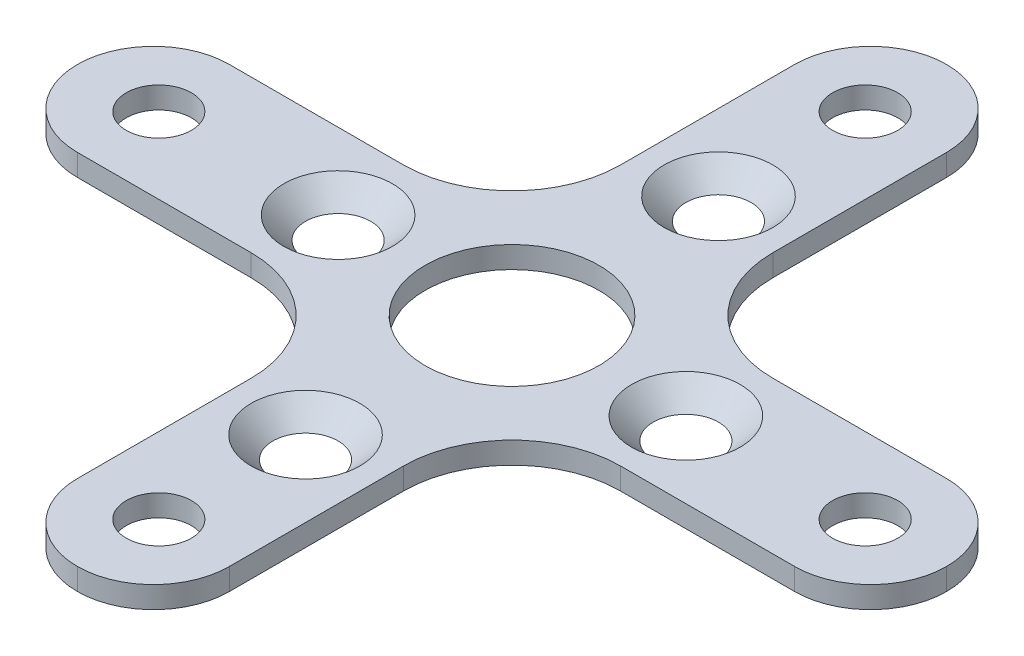
ISO-10303-21;
HEADER;
FILE_DESCRIPTION(('STEP AP214'),'2;1');
FILE_NAME('part.step','',(''),(''),'','','');
FILE_SCHEMA(('AUTOMOTIVE_DESIGN { 1 0 10303 214 1 1 1 1 }'));
ENDSEC;
DATA;
#1=APPLICATION_CONTEXT('core data for automotive mechanical design processes');
#2=APPLICATION_PROTOCOL_DEFINITION('international standard','automotive_design',2000,#1);
#3=PRODUCT_CONTEXT('',#1,'mechanical');
#4=PRODUCT('Part','Part','',(#3));
#5=PRODUCT_RELATED_PRODUCT_CATEGORY('part','',(#4));
#6=PRODUCT_DEFINITION_FORMATION('','',#4);
#7=PRODUCT_DEFINITION_CONTEXT('part definition',#1,'design');
#8=PRODUCT_DEFINITION('design','',#6,#7);
#9=PRODUCT_DEFINITION_SHAPE('','',#8);
#10=(LENGTH_UNIT() NAMED_UNIT(*) SI_UNIT(.MILLI.,.METRE.));
#11=(NAMED_UNIT(*) PLANE_ANGLE_UNIT() SI_UNIT($,.RADIAN.));
#12=(NAMED_UNIT(*) SI_UNIT($,.STERADIAN.) SOLID_ANGLE_UNIT());
#13=UNCERTAINTY_MEASURE_WITH_UNIT(LENGTH_MEASURE(1.E-05),#10,'distance_accuracy_value','');
#14=(GEOMETRIC_REPRESENTATION_CONTEXT(3) GLOBAL_UNCERTAINTY_ASSIGNED_CONTEXT((#13)) GLOBAL_UNIT_ASSIGNED_CONTEXT((#10,
#11,#12)) REPRESENTATION_CONTEXT('',''));
#15=CARTESIAN_POINT('',(0.,0.,0.));
#16=DIRECTION('',(0.,0.,1.));
#17=DIRECTION('',(1.,0.,0.));
#18=AXIS2_PLACEMENT_3D('',#15,#16,#17);
#19=CARTESIAN_POINT('',(0.,1.,3.49999999999999));
#20=DIRECTION('',(0.,0.,-1.));
#21=DIRECTION('',(-1.,0.,0.));
#22=AXIS2_PLACEMENT_3D('',#19,#20,#21);
#23=PLANE('',#22);
#24=DIRECTION('',(1.,0.,0.));
#25=VECTOR('',#24,1.);
#26=CARTESIAN_POINT('',(0.,1.,3.49999999999999));
#27=LINE('',#26,#25);
#28=CARTESIAN_POINT('',(-16.5,1.,3.49999999999999));
#29=VERTEX_POINT('',#28);
#30=CARTESIAN_POINT('',(-8.49999999999999,1.,3.49999999999999));
#31=VERTEX_POINT('',#30);
#32=EDGE_CURVE('E460',#29,#31,#27,.T.);
#33=ORIENTED_EDGE('',*,*,#32,.F.);
#34=DIRECTION('',(0.,-1.,0.));
#35=VECTOR('',#34,1.);
#36=CARTESIAN_POINT('',(-16.5,1.,3.49999999999999));
#37=LINE('',#36,#35);
#38=CARTESIAN_POINT('',(-16.5,0.,3.49999999999999));
#39=VERTEX_POINT('',#38);
#40=EDGE_CURVE('E331',#29,#39,#37,.T.);
#41=ORIENTED_EDGE('',*,*,#40,.T.);
#42=DIRECTION('',(1.,0.,0.));
#43=VECTOR('',#42,1.);
#44=CARTESIAN_POINT('',(0.,0.,3.49999999999999));
#45=LINE('',#44,#43);
#46=CARTESIAN_POINT('',(-8.49999999999999,0.,3.49999999999999));
#47=VERTEX_POINT('',#46);
#48=EDGE_CURVE('E419',#39,#47,#45,.T.);
#49=ORIENTED_EDGE('',*,*,#48,.T.);
#50=DIRECTION('',(0.,-1.,0.));
#51=VECTOR('',#50,1.);
#52=CARTESIAN_POINT('',(-8.49999999999999,1.,3.49999999999999));
#53=LINE('',#52,#51);
#54=EDGE_CURVE('E207',#47,#31,#53,.F.);
#55=ORIENTED_EDGE('',*,*,#54,.T.);
#56=EDGE_LOOP('',(#33,#41,#49,#55));
#57=FACE_BOUND('',#56,.T.);
#58=ADVANCED_FACE('F43',(#57),#23,.F.);
#59=CARTESIAN_POINT('',(-3.5,1.,0.));
#60=DIRECTION('',(1.,0.,0.));
#61=DIRECTION('',(0.,0.,-1.));
#62=AXIS2_PLACEMENT_3D('',#59,#60,#61);
#63=PLANE('',#62);
#64=DIRECTION('',(0.,0.,1.));
#65=VECTOR('',#64,1.);
#66=CARTESIAN_POINT('',(-3.5,0.,0.));
#67=LINE('',#66,#65);
#68=CARTESIAN_POINT('',(-3.5,0.,8.49999999999999));
#69=VERTEX_POINT('',#68);
#70=CARTESIAN_POINT('',(-3.5,0.,16.5));
#71=VERTEX_POINT('',#70);
#72=EDGE_CURVE('E415',#69,#71,#67,.T.);
#73=ORIENTED_EDGE('',*,*,#72,.T.);
#74=DIRECTION('',(0.,-1.,0.));
#75=VECTOR('',#74,1.);
#76=CARTESIAN_POINT('',(-3.5,1.,16.5));
#77=LINE('',#76,#75);
#78=CARTESIAN_POINT('',(-3.5,1.,16.5));
#79=VERTEX_POINT('',#78);
#80=EDGE_CURVE('E338',#71,#79,#77,.F.);
#81=ORIENTED_EDGE('',*,*,#80,.T.);
#82=DIRECTION('',(0.,0.,1.));
#83=VECTOR('',#82,1.);
#84=CARTESIAN_POINT('',(-3.5,1.,0.));
#85=LINE('',#84,#83);
#86=CARTESIAN_POINT('',(-3.5,1.,8.49999999999999));
#87=VERTEX_POINT('',#86);
#88=EDGE_CURVE('E456',#87,#79,#85,.T.);
#89=ORIENTED_EDGE('',*,*,#88,.F.);
#90=DIRECTION('',(0.,-1.,0.));
#91=VECTOR('',#90,1.);
#92=CARTESIAN_POINT('',(-3.5,0.,8.49999999999999));
#93=LINE('',#92,#91);
#94=EDGE_CURVE('E240',#87,#69,#93,.T.);
#95=ORIENTED_EDGE('',*,*,#94,.T.);
#96=EDGE_LOOP('',(#73,#81,#89,#95));
#97=FACE_BOUND('',#96,.T.);
#98=ADVANCED_FACE('F512',(#97),#63,.F.);
#99=CARTESIAN_POINT('',(3.5,1.,0.));
#100=DIRECTION('',(1.,0.,0.));
#101=DIRECTION('',(0.,0.,-1.));
#102=AXIS2_PLACEMENT_3D('',#99,#100,#101);
#103=PLANE('',#102);
#104=DIRECTION('',(0.,0.,1.));
#105=VECTOR('',#104,1.);
#106=CARTESIAN_POINT('',(3.5,1.,0.));
#107=LINE('',#106,#105);
#108=CARTESIAN_POINT('',(3.5,1.,8.49999999999999));
#109=VERTEX_POINT('',#108);
#110=CARTESIAN_POINT('',(3.5,1.,16.5));
#111=VERTEX_POINT('',#110);
#112=EDGE_CURVE('E452',#109,#111,#107,.T.);
#113=ORIENTED_EDGE('',*,*,#112,.T.);
#114=DIRECTION('',(0.,-1.,0.));
#115=VECTOR('',#114,1.);
#116=CARTESIAN_POINT('',(3.5,0.,16.5));
#117=LINE('',#116,#115);
#118=CARTESIAN_POINT('',(3.5,0.,16.5));
#119=VERTEX_POINT('',#118);
#120=EDGE_CURVE('E334',#111,#119,#117,.T.);
#121=ORIENTED_EDGE('',*,*,#120,.T.);
#122=DIRECTION('',(0.,0.,1.));
#123=VECTOR('',#122,1.);
#124=CARTESIAN_POINT('',(3.5,0.,0.));
#125=LINE('',#124,#123);
#126=CARTESIAN_POINT('',(3.5,0.,8.49999999999999));
#127=VERTEX_POINT('',#126);
#128=EDGE_CURVE('E411',#127,#119,#125,.T.);
#129=ORIENTED_EDGE('',*,*,#128,.F.);
#130=DIRECTION('',(0.,-1.,0.));
#131=VECTOR('',#130,1.);
#132=CARTESIAN_POINT('',(3.5,1.,8.49999999999999));
#133=LINE('',#132,#131);
#134=EDGE_CURVE('E237',#127,#109,#133,.F.);
#135=ORIENTED_EDGE('',*,*,#134,.T.);
#136=EDGE_LOOP('',(#113,#121,#129,#135));
#137=FACE_BOUND('',#136,.T.);
#138=ADVANCED_FACE('F518',(#137),#103,.T.);
#139=CARTESIAN_POINT('',(0.,1.,3.49999999999999));
#140=DIRECTION('',(0.,0.,-1.));
#141=DIRECTION('',(-1.,0.,0.));
#142=AXIS2_PLACEMENT_3D('',#139,#140,#141);
#143=PLANE('',#142);
#144=DIRECTION('',(1.,0.,0.));
#145=VECTOR('',#144,1.);
#146=CARTESIAN_POINT('',(0.,0.,3.49999999999999));
#147=LINE('',#146,#145);
#148=CARTESIAN_POINT('',(8.5,0.,3.49999999999999));
#149=VERTEX_POINT('',#148);
#150=CARTESIAN_POINT('',(16.5,0.,3.49999999999999));
#151=VERTEX_POINT('',#150);
#152=EDGE_CURVE('E407',#149,#151,#147,.T.);
#153=ORIENTED_EDGE('',*,*,#152,.T.);
#154=DIRECTION('',(0.,-1.,0.));
#155=VECTOR('',#154,1.);
#156=CARTESIAN_POINT('',(16.5,1.,3.49999999999999));
#157=LINE('',#156,#155);
#158=CARTESIAN_POINT('',(16.5,1.,3.49999999999999));
#159=VERTEX_POINT('',#158);
#160=EDGE_CURVE('E292',#151,#159,#157,.F.);
#161=ORIENTED_EDGE('',*,*,#160,.T.);
#162=DIRECTION('',(1.,0.,0.));
#163=VECTOR('',#162,1.);
#164=CARTESIAN_POINT('',(0.,1.,3.49999999999999));
#165=LINE('',#164,#163);
#166=CARTESIAN_POINT('',(8.5,1.,3.49999999999999));
#167=VERTEX_POINT('',#166);
#168=EDGE_CURVE('E448',#167,#159,#165,.T.);
#169=ORIENTED_EDGE('',*,*,#168,.F.);
#170=DIRECTION('',(0.,-1.,0.));
#171=VECTOR('',#170,1.);
#172=CARTESIAN_POINT('',(8.5,1.,3.49999999999999));
#173=LINE('',#172,#171);
#174=EDGE_CURVE('E233',#167,#149,#173,.T.);
#175=ORIENTED_EDGE('',*,*,#174,.T.);
#176=EDGE_LOOP('',(#153,#161,#169,#175));
#177=FACE_BOUND('',#176,.T.);
#178=ADVANCED_FACE('F625',(#177),#143,.F.);
#179=CARTESIAN_POINT('',(0.,1.,-3.50000000000001));
#180=DIRECTION('',(0.,0.,-1.));
#181=DIRECTION('',(-1.,0.,0.));
#182=AXIS2_PLACEMENT_3D('',#179,#180,#181);
#183=PLANE('',#182);
#184=DIRECTION('',(1.,0.,0.));
#185=VECTOR('',#184,1.);
#186=CARTESIAN_POINT('',(0.,1.,-3.50000000000001));
#187=LINE('',#186,#185);
#188=CARTESIAN_POINT('',(8.5,1.,-3.50000000000001));
#189=VERTEX_POINT('',#188);
#190=CARTESIAN_POINT('',(16.5,1.,-3.50000000000001));
#191=VERTEX_POINT('',#190);
#192=EDGE_CURVE('E444',#189,#191,#187,.T.);
#193=ORIENTED_EDGE('',*,*,#192,.T.);
#194=DIRECTION('',(0.,-1.,0.));
#195=VECTOR('',#194,1.);
#196=CARTESIAN_POINT('',(16.5,1.,-3.50000000000001));
#197=LINE('',#196,#195);
#198=CARTESIAN_POINT('',(16.5,0.,-3.50000000000001));
#199=VERTEX_POINT('',#198);
#200=EDGE_CURVE('E318',#191,#199,#197,.T.);
#201=ORIENTED_EDGE('',*,*,#200,.T.);
#202=DIRECTION('',(1.,0.,0.));
#203=VECTOR('',#202,1.);
#204=CARTESIAN_POINT('',(0.,0.,-3.50000000000001));
#205=LINE('',#204,#203);
#206=CARTESIAN_POINT('',(8.5,0.,-3.50000000000001));
#207=VERTEX_POINT('',#206);
#208=EDGE_CURVE('E403',#207,#199,#205,.T.);
#209=ORIENTED_EDGE('',*,*,#208,.F.);
#210=DIRECTION('',(0.,-1.,0.));
#211=VECTOR('',#210,1.);
#212=CARTESIAN_POINT('',(8.5,1.,-3.50000000000001));
#213=LINE('',#212,#211);
#214=EDGE_CURVE('E230',#207,#189,#213,.F.);
#215=ORIENTED_EDGE('',*,*,#214,.T.);
#216=EDGE_LOOP('',(#193,#201,#209,#215));
#217=FACE_BOUND('',#216,.T.);
#218=ADVANCED_FACE('F621',(#217),#183,.T.);
#219=CARTESIAN_POINT('',(3.5,1.,0.));
#220=DIRECTION('',(1.,0.,0.));
#221=DIRECTION('',(0.,0.,-1.));
#222=AXIS2_PLACEMENT_3D('',#219,#220,#221);
#223=PLANE('',#222);
#224=DIRECTION('',(0.,0.,1.));
#225=VECTOR('',#224,1.);
#226=CARTESIAN_POINT('',(3.5,0.,0.));
#227=LINE('',#226,#225);
#228=CARTESIAN_POINT('',(3.5,0.,-16.5));
#229=VERTEX_POINT('',#228);
#230=CARTESIAN_POINT('',(3.5,0.,-8.50000000000001));
#231=VERTEX_POINT('',#230);
#232=EDGE_CURVE('E400',#229,#231,#227,.T.);
#233=ORIENTED_EDGE('',*,*,#232,.F.);
#234=DIRECTION('',(0.,-1.,0.));
#235=VECTOR('',#234,1.);
#236=CARTESIAN_POINT('',(3.5,1.,-16.5));
#237=LINE('',#236,#235);
#238=CARTESIAN_POINT('',(3.5,1.,-16.5));
#239=VERTEX_POINT('',#238);
#240=EDGE_CURVE('E321',#229,#239,#237,.F.);
#241=ORIENTED_EDGE('',*,*,#240,.T.);
#242=DIRECTION('',(0.,0.,1.));
#243=VECTOR('',#242,1.);
#244=CARTESIAN_POINT('',(3.5,1.,0.));
#245=LINE('',#244,#243);
#246=CARTESIAN_POINT('',(3.5,1.,-8.50000000000001));
#247=VERTEX_POINT('',#246);
#248=EDGE_CURVE('E441',#239,#247,#245,.T.);
#249=ORIENTED_EDGE('',*,*,#248,.T.);
#250=DIRECTION('',(0.,-1.,0.));
#251=VECTOR('',#250,1.);
#252=CARTESIAN_POINT('',(3.5,0.,-8.50000000000001));
#253=LINE('',#252,#251);
#254=EDGE_CURVE('E218',#247,#231,#253,.T.);
#255=ORIENTED_EDGE('',*,*,#254,.T.);
#256=EDGE_LOOP('',(#233,#241,#249,#255));
#257=FACE_BOUND('',#256,.T.);
#258=ADVANCED_FACE('F615',(#257),#223,.T.);
#259=CARTESIAN_POINT('',(-3.5,1.,0.));
#260=DIRECTION('',(1.,0.,0.));
#261=DIRECTION('',(0.,0.,-1.));
#262=AXIS2_PLACEMENT_3D('',#259,#260,#261);
#263=PLANE('',#262);
#264=DIRECTION('',(0.,0.,1.));
#265=VECTOR('',#264,1.);
#266=CARTESIAN_POINT('',(-3.5,1.,0.));
#267=LINE('',#266,#265);
#268=CARTESIAN_POINT('',(-3.5,1.,-16.5));
#269=VERTEX_POINT('',#268);
#270=CARTESIAN_POINT('',(-3.5,1.,-8.50000000000001));
#271=VERTEX_POINT('',#270);
#272=EDGE_CURVE('E438',#269,#271,#267,.T.);
#273=ORIENTED_EDGE('',*,*,#272,.F.);
#274=DIRECTION('',(0.,-1.,0.));
#275=VECTOR('',#274,1.);
#276=CARTESIAN_POINT('',(-3.5,0.,-16.5));
#277=LINE('',#276,#275);
#278=CARTESIAN_POINT('',(-3.5,0.,-16.5));
#279=VERTEX_POINT('',#278);
#280=EDGE_CURVE('E325',#269,#279,#277,.T.);
#281=ORIENTED_EDGE('',*,*,#280,.T.);
#282=DIRECTION('',(0.,0.,1.));
#283=VECTOR('',#282,1.);
#284=CARTESIAN_POINT('',(-3.5,0.,0.));
#285=LINE('',#284,#283);
#286=CARTESIAN_POINT('',(-3.5,0.,-8.50000000000001));
#287=VERTEX_POINT('',#286);
#288=EDGE_CURVE('E196',#279,#287,#285,.T.);
#289=ORIENTED_EDGE('',*,*,#288,.T.);
#290=DIRECTION('',(0.,-1.,0.));
#291=VECTOR('',#290,1.);
#292=CARTESIAN_POINT('',(-3.5,1.,-8.50000000000001));
#293=LINE('',#292,#291);
#294=EDGE_CURVE('E204',#287,#271,#293,.F.);
#295=ORIENTED_EDGE('',*,*,#294,.T.);
#296=EDGE_LOOP('',(#273,#281,#289,#295));
#297=FACE_BOUND('',#296,.T.);
#298=ADVANCED_FACE('F607',(#297),#263,.F.);
#299=CARTESIAN_POINT('',(0.,1.,-16.25));
#300=DIRECTION('',(0.,-1.,0.));
#301=DIRECTION('',(0.,0.,-1.));
#302=AXIS2_PLACEMENT_3D('',#299,#300,#301);
#303=CYLINDRICAL_SURFACE('',#302,1.5);
#304=CARTESIAN_POINT('',(0.,1.,-16.25));
#305=DIRECTION('',(0.,1.,0.));
#306=DIRECTION('',(0.,0.,1.));
#307=AXIS2_PLACEMENT_3D('',#304,#305,#306);
#308=CIRCLE('',#307,1.5);
#309=CARTESIAN_POINT('',(0.,1.,-14.75));
#310=VERTEX_POINT('',#309);
#311=EDGE_CURVE('E221',#310,#310,#308,.T.);
#312=ORIENTED_EDGE('',*,*,#311,.T.);
#313=EDGE_LOOP('',(#312));
#314=FACE_BOUND('',#313,.T.);
#315=CARTESIAN_POINT('',(0.,0.,-16.25));
#316=DIRECTION('',(0.,1.,0.));
#317=DIRECTION('',(0.,0.,1.));
#318=AXIS2_PLACEMENT_3D('',#315,#316,#317);
#319=CIRCLE('',#318,1.5);
#320=CARTESIAN_POINT('',(0.,0.,-14.75));
#321=VERTEX_POINT('',#320);
#322=EDGE_CURVE('E383',#321,#321,#319,.T.);
#323=ORIENTED_EDGE('',*,*,#322,.F.);
#324=EDGE_LOOP('',(#323));
#325=FACE_BOUND('',#324,.T.);
#326=ADVANCED_FACE('F605',(#314,#325),#303,.F.);
#327=CARTESIAN_POINT('',(0.,1.,-3.50000000000001));
#328=DIRECTION('',(0.,0.,-1.));
#329=DIRECTION('',(-1.,0.,0.));
#330=AXIS2_PLACEMENT_3D('',#327,#328,#329);
#331=PLANE('',#330);
#332=DIRECTION('',(1.,0.,0.));
#333=VECTOR('',#332,1.);
#334=CARTESIAN_POINT('',(0.,0.,-3.50000000000001));
#335=LINE('',#334,#333);
#336=CARTESIAN_POINT('',(-16.5,0.,-3.50000000000001));
#337=VERTEX_POINT('',#336);
#338=CARTESIAN_POINT('',(-8.5,0.,-3.50000000000001));
#339=VERTEX_POINT('',#338);
#340=EDGE_CURVE('E183',#337,#339,#335,.T.);
#341=ORIENTED_EDGE('',*,*,#340,.F.);
#342=DIRECTION('',(0.,-1.,0.));
#343=VECTOR('',#342,1.);
#344=CARTESIAN_POINT('',(-16.5,1.,-3.50000000000001));
#345=LINE('',#344,#343);
#346=CARTESIAN_POINT('',(-16.5,1.,-3.50000000000001));
#347=VERTEX_POINT('',#346);
#348=EDGE_CURVE('E328',#337,#347,#345,.F.);
#349=ORIENTED_EDGE('',*,*,#348,.T.);
#350=DIRECTION('',(1.,0.,0.));
#351=VECTOR('',#350,1.);
#352=CARTESIAN_POINT('',(0.,1.,-3.50000000000001));
#353=LINE('',#352,#351);
#354=CARTESIAN_POINT('',(-8.5,1.,-3.50000000000001));
#355=VERTEX_POINT('',#354);
#356=EDGE_CURVE('E211',#347,#355,#353,.T.);
#357=ORIENTED_EDGE('',*,*,#356,.T.);
#358=DIRECTION('',(0.,-1.,0.));
#359=VECTOR('',#358,1.);
#360=CARTESIAN_POINT('',(-8.5,1.,-3.50000000000001));
#361=LINE('',#360,#359);
#362=EDGE_CURVE('E202',#355,#339,#361,.T.);
#363=ORIENTED_EDGE('',*,*,#362,.T.);
#364=EDGE_LOOP('',(#341,#349,#357,#363));
#365=FACE_BOUND('',#364,.T.);
#366=ADVANCED_FACE('F209',(#365),#331,.T.);
#367=CARTESIAN_POINT('',(0.,1.,16.25));
#368=DIRECTION('',(0.,-1.,0.));
#369=DIRECTION('',(0.,0.,-1.));
#370=AXIS2_PLACEMENT_3D('',#367,#368,#369);
#371=CYLINDRICAL_SURFACE('',#370,1.5);
#372=CARTESIAN_POINT('',(0.,1.,16.25));
#373=DIRECTION('',(0.,1.,0.));
#374=DIRECTION('',(0.,0.,1.));
#375=AXIS2_PLACEMENT_3D('',#372,#373,#374);
#376=CIRCLE('',#375,1.5);
#377=CARTESIAN_POINT('',(0.,1.,17.75));
#378=VERTEX_POINT('',#377);
#379=EDGE_CURVE('E463',#378,#378,#376,.T.);
#380=ORIENTED_EDGE('',*,*,#379,.T.);
#381=EDGE_LOOP('',(#380));
#382=FACE_BOUND('',#381,.T.);
#383=CARTESIAN_POINT('',(0.,0.,16.25));
#384=DIRECTION('',(0.,1.,0.));
#385=DIRECTION('',(0.,0.,1.));
#386=AXIS2_PLACEMENT_3D('',#383,#384,#385);
#387=CIRCLE('',#386,1.5);
#388=CARTESIAN_POINT('',(0.,0.,17.75));
#389=VERTEX_POINT('',#388);
#390=EDGE_CURVE('E422',#389,#389,#387,.T.);
#391=ORIENTED_EDGE('',*,*,#390,.F.);
#392=EDGE_LOOP('',(#391));
#393=FACE_BOUND('',#392,.T.);
#394=ADVANCED_FACE('F524',(#382,#393),#371,.F.);
#395=CARTESIAN_POINT('',(-16.25,1.,0.));
#396=DIRECTION('',(0.,-1.,0.));
#397=DIRECTION('',(0.,0.,-1.));
#398=AXIS2_PLACEMENT_3D('',#395,#396,#397);
#399=CYLINDRICAL_SURFACE('',#398,1.5);
#400=CARTESIAN_POINT('',(-16.25,1.,0.));
#401=DIRECTION('',(0.,1.,0.));
#402=DIRECTION('',(0.,0.,1.));
#403=AXIS2_PLACEMENT_3D('',#400,#401,#402);
#404=CIRCLE('',#403,1.5);
#405=CARTESIAN_POINT('',(-16.25,1.,1.49999999999999));
#406=VERTEX_POINT('',#405);
#407=EDGE_CURVE('E387',#406,#406,#404,.T.);
#408=ORIENTED_EDGE('',*,*,#407,.T.);
#409=EDGE_LOOP('',(#408));
#410=FACE_BOUND('',#409,.T.);
#411=CARTESIAN_POINT('',(-16.25,0.,0.));
#412=DIRECTION('',(0.,1.,0.));
#413=DIRECTION('',(0.,0.,1.));
#414=AXIS2_PLACEMENT_3D('',#411,#412,#413);
#415=CIRCLE('',#414,1.5);
#416=CARTESIAN_POINT('',(-16.25,0.,1.49999999999999));
#417=VERTEX_POINT('',#416);
#418=EDGE_CURVE('E346',#417,#417,#415,.T.);
#419=ORIENTED_EDGE('',*,*,#418,.F.);
#420=EDGE_LOOP('',(#419));
#421=FACE_BOUND('',#420,.T.);
#422=ADVANCED_FACE('F497',(#410,#421),#399,.F.);
#423=CARTESIAN_POINT('',(16.25,1.,0.));
#424=DIRECTION('',(0.,-1.,0.));
#425=DIRECTION('',(0.,0.,-1.));
#426=AXIS2_PLACEMENT_3D('',#423,#424,#425);
#427=CYLINDRICAL_SURFACE('',#426,1.5);
#428=CARTESIAN_POINT('',(16.25,1.,0.));
#429=DIRECTION('',(0.,1.,0.));
#430=DIRECTION('',(0.,0.,1.));
#431=AXIS2_PLACEMENT_3D('',#428,#429,#430);
#432=CIRCLE('',#431,1.5);
#433=CARTESIAN_POINT('',(16.25,1.,1.49999999999999));
#434=VERTEX_POINT('',#433);
#435=EDGE_CURVE('E214',#434,#434,#432,.T.);
#436=ORIENTED_EDGE('',*,*,#435,.T.);
#437=EDGE_LOOP('',(#436));
#438=FACE_BOUND('',#437,.T.);
#439=CARTESIAN_POINT('',(16.25,0.,0.));
#440=DIRECTION('',(0.,1.,0.));
#441=DIRECTION('',(0.,0.,1.));
#442=AXIS2_PLACEMENT_3D('',#439,#440,#441);
#443=CIRCLE('',#442,1.5);
#444=CARTESIAN_POINT('',(16.25,0.,1.49999999999999));
#445=VERTEX_POINT('',#444);
#446=EDGE_CURVE('E224',#445,#445,#443,.T.);
#447=ORIENTED_EDGE('',*,*,#446,.F.);
#448=EDGE_LOOP('',(#447));
#449=FACE_BOUND('',#448,.T.);
#450=ADVANCED_FACE('F483',(#438,#449),#427,.F.);
#451=CARTESIAN_POINT('',(0.,1.,0.));
#452=DIRECTION('',(0.,1.,0.));
#453=DIRECTION('',(0.,0.,1.));
#454=AXIS2_PLACEMENT_3D('',#451,#452,#453);
#455=PLANE('',#454);
#456=CARTESIAN_POINT('',(0.,1.,-9.5));
#457=DIRECTION('',(0.,1.,0.));
#458=DIRECTION('',(0.,0.,1.));
#459=AXIS2_PLACEMENT_3D('',#456,#457,#458);
#460=CIRCLE('',#459,2.5);
#461=CARTESIAN_POINT('',(0.,1.,-7.));
#462=VERTEX_POINT('',#461);
#463=EDGE_CURVE('E11',#462,#462,#460,.F.);
#464=ORIENTED_EDGE('',*,*,#463,.T.);
#465=EDGE_LOOP('',(#464));
#466=FACE_BOUND('',#465,.T.);
#467=CARTESIAN_POINT('',(8.,1.,0.));
#468=DIRECTION('',(0.,1.,0.));
#469=DIRECTION('',(0.,0.,1.));
#470=AXIS2_PLACEMENT_3D('',#467,#468,#469);
#471=CIRCLE('',#470,2.50000000000002);
#472=CARTESIAN_POINT('',(8.,1.,2.50000000000001));
#473=VERTEX_POINT('',#472);
#474=EDGE_CURVE('E53',#473,#473,#471,.F.);
#475=ORIENTED_EDGE('',*,*,#474,.T.);
#476=EDGE_LOOP('',(#475));
#477=FACE_BOUND('',#476,.T.);
#478=CARTESIAN_POINT('',(-8.,1.,0.));
#479=DIRECTION('',(0.,1.,0.));
#480=DIRECTION('',(0.,0.,1.));
#481=AXIS2_PLACEMENT_3D('',#478,#479,#480);
#482=CIRCLE('',#481,2.50000000000002);
#483=CARTESIAN_POINT('',(-8.,1.,2.50000000000001));
#484=VERTEX_POINT('',#483);
#485=EDGE_CURVE('E362',#484,#484,#482,.F.);
#486=ORIENTED_EDGE('',*,*,#485,.T.);
#487=EDGE_LOOP('',(#486));
#488=FACE_BOUND('',#487,.T.);
#489=CARTESIAN_POINT('',(0.,1.,9.5));
#490=DIRECTION('',(0.,1.,0.));
#491=DIRECTION('',(0.,0.,1.));
#492=AXIS2_PLACEMENT_3D('',#489,#490,#491);
#493=CIRCLE('',#492,2.50000000000002);
#494=CARTESIAN_POINT('',(0.,1.,12.));
#495=VERTEX_POINT('',#494);
#496=EDGE_CURVE('E341',#495,#495,#493,.F.);
#497=ORIENTED_EDGE('',*,*,#496,.T.);
#498=EDGE_LOOP('',(#497));
#499=FACE_BOUND('',#498,.T.);
#500=CARTESIAN_POINT('',(0.,1.,0.));
#501=DIRECTION('',(0.,1.,0.));
#502=DIRECTION('',(0.,0.,1.));
#503=AXIS2_PLACEMENT_3D('',#500,#501,#502);
#504=CIRCLE('',#503,4.);
#505=CARTESIAN_POINT('',(0.,1.,4.));
#506=VERTEX_POINT('',#505);
#507=EDGE_CURVE('E473',#506,#506,#504,.T.);
#508=ORIENTED_EDGE('',*,*,#507,.F.);
#509=EDGE_LOOP('',(#508));
#510=FACE_BOUND('',#509,.T.);
#511=ORIENTED_EDGE('',*,*,#407,.F.);
#512=EDGE_LOOP('',(#511));
#513=FACE_BOUND('',#512,.T.);
#514=ORIENTED_EDGE('',*,*,#379,.F.);
#515=EDGE_LOOP('',(#514));
#516=FACE_BOUND('',#515,.T.);
#517=ORIENTED_EDGE('',*,*,#168,.T.);
#518=CARTESIAN_POINT('',(16.5,1.,0.));
#519=DIRECTION('',(0.,1.,0.));
#520=DIRECTION('',(0.,0.,1.));
#521=AXIS2_PLACEMENT_3D('',#518,#519,#520);
#522=CIRCLE('',#521,3.5);
#523=CARTESIAN_POINT('',(20.,1.,0.));
#524=VERTEX_POINT('',#523);
#525=EDGE_CURVE('E315',#159,#524,#522,.T.);
#526=ORIENTED_EDGE('',*,*,#525,.T.);
#527=CARTESIAN_POINT('',(16.5,1.,0.));
#528=DIRECTION('',(0.,1.,0.));
#529=DIRECTION('',(0.,0.,1.));
#530=AXIS2_PLACEMENT_3D('',#527,#528,#529);
#531=CIRCLE('',#530,3.5);
#532=EDGE_CURVE('E312',#524,#191,#531,.T.);
#533=ORIENTED_EDGE('',*,*,#532,.T.);
#534=ORIENTED_EDGE('',*,*,#192,.F.);
#535=CARTESIAN_POINT('',(8.5,1.,-8.50000000000001));
#536=DIRECTION('',(0.,1.,0.));
#537=DIRECTION('',(0.,0.,1.));
#538=AXIS2_PLACEMENT_3D('',#535,#536,#537);
#539=CIRCLE('',#538,5.);
#540=EDGE_CURVE('E252',#189,#247,#539,.F.);
#541=ORIENTED_EDGE('',*,*,#540,.T.);
#542=ORIENTED_EDGE('',*,*,#248,.F.);
#543=CARTESIAN_POINT('',(0.,1.,-16.5));
#544=DIRECTION('',(0.,1.,0.));
#545=DIRECTION('',(0.,0.,1.));
#546=AXIS2_PLACEMENT_3D('',#543,#544,#545);
#547=CIRCLE('',#546,3.5);
#548=CARTESIAN_POINT('',(0.,1.,-20.));
#549=VERTEX_POINT('',#548);
#550=EDGE_CURVE('E309',#239,#549,#547,.T.);
#551=ORIENTED_EDGE('',*,*,#550,.T.);
#552=CARTESIAN_POINT('',(0.,1.,-16.5));
#553=DIRECTION('',(0.,1.,0.));
#554=DIRECTION('',(0.,0.,1.));
#555=AXIS2_PLACEMENT_3D('',#552,#553,#554);
#556=CIRCLE('',#555,3.5);
#557=EDGE_CURVE('E68',#549,#269,#556,.T.);
#558=ORIENTED_EDGE('',*,*,#557,.T.);
#559=ORIENTED_EDGE('',*,*,#272,.T.);
#560=CARTESIAN_POINT('',(-8.5,1.,-8.50000000000001));
#561=DIRECTION('',(0.,1.,0.));
#562=DIRECTION('',(0.,0.,1.));
#563=AXIS2_PLACEMENT_3D('',#560,#561,#562);
#564=CIRCLE('',#563,5.);
#565=EDGE_CURVE('E206',#271,#355,#564,.F.);
#566=ORIENTED_EDGE('',*,*,#565,.T.);
#567=ORIENTED_EDGE('',*,*,#356,.F.);
#568=CARTESIAN_POINT('',(-16.5,1.,0.));
#569=DIRECTION('',(0.,1.,0.));
#570=DIRECTION('',(0.,0.,1.));
#571=AXIS2_PLACEMENT_3D('',#568,#569,#570);
#572=CIRCLE('',#571,3.5);
#573=CARTESIAN_POINT('',(-20.,1.,0.));
#574=VERTEX_POINT('',#573);
#575=EDGE_CURVE('E60',#347,#574,#572,.T.);
#576=ORIENTED_EDGE('',*,*,#575,.T.);
#577=CARTESIAN_POINT('',(-16.5,1.,0.));
#578=DIRECTION('',(0.,1.,0.));
#579=DIRECTION('',(0.,0.,1.));
#580=AXIS2_PLACEMENT_3D('',#577,#578,#579);
#581=CIRCLE('',#580,3.5);
#582=EDGE_CURVE('E302',#574,#29,#581,.T.);
#583=ORIENTED_EDGE('',*,*,#582,.T.);
#584=ORIENTED_EDGE('',*,*,#32,.T.);
#585=CARTESIAN_POINT('',(-8.49999999999999,1.,8.49999999999999));
#586=DIRECTION('',(0.,1.,0.));
#587=DIRECTION('',(0.,0.,1.));
#588=AXIS2_PLACEMENT_3D('',#585,#586,#587);
#589=CIRCLE('',#588,5.);
#590=EDGE_CURVE('E266',#31,#87,#589,.F.);
#591=ORIENTED_EDGE('',*,*,#590,.T.);
#592=ORIENTED_EDGE('',*,*,#88,.T.);
#593=CARTESIAN_POINT('',(0.,1.,16.5));
#594=DIRECTION('',(0.,1.,0.));
#595=DIRECTION('',(0.,0.,1.));
#596=AXIS2_PLACEMENT_3D('',#593,#594,#595);
#597=CIRCLE('',#596,3.5);
#598=CARTESIAN_POINT('',(0.,1.,20.));
#599=VERTEX_POINT('',#598);
#600=EDGE_CURVE('E296',#79,#599,#597,.T.);
#601=ORIENTED_EDGE('',*,*,#600,.T.);
#602=CARTESIAN_POINT('',(0.,1.,16.5));
#603=DIRECTION('',(0.,1.,0.));
#604=DIRECTION('',(0.,0.,1.));
#605=AXIS2_PLACEMENT_3D('',#602,#603,#604);
#606=CIRCLE('',#605,3.5);
#607=EDGE_CURVE('E299',#599,#111,#606,.T.);
#608=ORIENTED_EDGE('',*,*,#607,.T.);
#609=ORIENTED_EDGE('',*,*,#112,.F.);
#610=CARTESIAN_POINT('',(8.5,1.,8.49999999999999));
#611=DIRECTION('',(0.,1.,0.));
#612=DIRECTION('',(0.,0.,1.));
#613=AXIS2_PLACEMENT_3D('',#610,#611,#612);
#614=CIRCLE('',#613,5.);
#615=EDGE_CURVE('E259',#109,#167,#614,.F.);
#616=ORIENTED_EDGE('',*,*,#615,.T.);
#617=EDGE_LOOP('',(#517,#526,#533,#534,#541,#542,#551,#558,#559,#566,#567,#576,#583,#584,#591,
#592,#601,#608,#609,#616));
#618=FACE_BOUND('',#617,.T.);
#619=ORIENTED_EDGE('',*,*,#311,.F.);
#620=EDGE_LOOP('',(#619));
#621=FACE_BOUND('',#620,.T.);
#622=ORIENTED_EDGE('',*,*,#435,.F.);
#623=EDGE_LOOP('',(#622));
#624=FACE_BOUND('',#623,.T.);
#625=ADVANCED_FACE('F369',(#466,#477,#488,#499,#510,#513,#516,#618,#621,#624),#455,.T.);
#626=CARTESIAN_POINT('',(0.,0.,0.));
#627=DIRECTION('',(0.,1.,0.));
#628=DIRECTION('',(0.,0.,1.));
#629=AXIS2_PLACEMENT_3D('',#626,#627,#628);
#630=PLANE('',#629);
#631=CARTESIAN_POINT('',(0.,0.,0.));
#632=DIRECTION('',(0.,1.,0.));
#633=DIRECTION('',(0.,0.,1.));
#634=AXIS2_PLACEMENT_3D('',#631,#632,#633);
#635=CIRCLE('',#634,4.);
#636=CARTESIAN_POINT('',(0.,0.,4.));
#637=VERTEX_POINT('',#636);
#638=EDGE_CURVE('E358',#637,#637,#635,.F.);
#639=ORIENTED_EDGE('',*,*,#638,.F.);
#640=EDGE_LOOP('',(#639));
#641=FACE_BOUND('',#640,.T.);
#642=ORIENTED_EDGE('',*,*,#418,.T.);
#643=EDGE_LOOP('',(#642));
#644=FACE_BOUND('',#643,.T.);
#645=CARTESIAN_POINT('',(-8.,0.,0.));
#646=DIRECTION('',(0.,1.,0.));
#647=DIRECTION('',(0.,0.,1.));
#648=AXIS2_PLACEMENT_3D('',#645,#646,#647);
#649=CIRCLE('',#648,1.5);
#650=CARTESIAN_POINT('',(-8.,0.,1.49999999999999));
#651=VERTEX_POINT('',#650);
#652=EDGE_CURVE('E426',#651,#651,#649,.T.);
#653=ORIENTED_EDGE('',*,*,#652,.T.);
#654=EDGE_LOOP('',(#653));
#655=FACE_BOUND('',#654,.T.);
#656=ORIENTED_EDGE('',*,*,#390,.T.);
#657=EDGE_LOOP('',(#656));
#658=FACE_BOUND('',#657,.T.);
#659=CARTESIAN_POINT('',(16.5,0.,0.));
#660=DIRECTION('',(0.,1.,0.));
#661=DIRECTION('',(0.,0.,1.));
#662=AXIS2_PLACEMENT_3D('',#659,#660,#661);
#663=CIRCLE('',#662,3.5);
#664=CARTESIAN_POINT('',(20.,0.,0.));
#665=VERTEX_POINT('',#664);
#666=EDGE_CURVE('E286',#199,#665,#663,.F.);
#667=ORIENTED_EDGE('',*,*,#666,.T.);
#668=CARTESIAN_POINT('',(16.5,0.,0.));
#669=DIRECTION('',(0.,1.,0.));
#670=DIRECTION('',(0.,0.,1.));
#671=AXIS2_PLACEMENT_3D('',#668,#669,#670);
#672=CIRCLE('',#671,3.5);
#673=EDGE_CURVE('E289',#665,#151,#672,.F.);
#674=ORIENTED_EDGE('',*,*,#673,.T.);
#675=ORIENTED_EDGE('',*,*,#152,.F.);
#676=CARTESIAN_POINT('',(8.5,0.,8.49999999999999));
#677=DIRECTION('',(0.,1.,0.));
#678=DIRECTION('',(0.,0.,1.));
#679=AXIS2_PLACEMENT_3D('',#676,#677,#678);
#680=CIRCLE('',#679,5.);
#681=EDGE_CURVE('E256',#149,#127,#680,.T.);
#682=ORIENTED_EDGE('',*,*,#681,.T.);
#683=ORIENTED_EDGE('',*,*,#128,.T.);
#684=CARTESIAN_POINT('',(0.,0.,16.5));
#685=DIRECTION('',(0.,1.,0.));
#686=DIRECTION('',(0.,0.,1.));
#687=AXIS2_PLACEMENT_3D('',#684,#685,#686);
#688=CIRCLE('',#687,3.5);
#689=CARTESIAN_POINT('',(0.,0.,20.));
#690=VERTEX_POINT('',#689);
#691=EDGE_CURVE('E272',#119,#690,#688,.F.);
#692=ORIENTED_EDGE('',*,*,#691,.T.);
#693=CARTESIAN_POINT('',(0.,0.,16.5));
#694=DIRECTION('',(0.,1.,0.));
#695=DIRECTION('',(0.,0.,1.));
#696=AXIS2_PLACEMENT_3D('',#693,#694,#695);
#697=CIRCLE('',#696,3.5);
#698=EDGE_CURVE('E269',#690,#71,#697,.F.);
#699=ORIENTED_EDGE('',*,*,#698,.T.);
#700=ORIENTED_EDGE('',*,*,#72,.F.);
#701=CARTESIAN_POINT('',(-8.49999999999999,0.,8.49999999999999));
#702=DIRECTION('',(0.,1.,0.));
#703=DIRECTION('',(0.,0.,1.));
#704=AXIS2_PLACEMENT_3D('',#701,#702,#703);
#705=CIRCLE('',#704,5.);
#706=EDGE_CURVE('E262',#69,#47,#705,.T.);
#707=ORIENTED_EDGE('',*,*,#706,.T.);
#708=ORIENTED_EDGE('',*,*,#48,.F.);
#709=CARTESIAN_POINT('',(-16.5,0.,0.));
#710=DIRECTION('',(0.,1.,0.));
#711=DIRECTION('',(0.,0.,1.));
#712=AXIS2_PLACEMENT_3D('',#709,#710,#711);
#713=CIRCLE('',#712,3.5);
#714=CARTESIAN_POINT('',(-20.,0.,0.));
#715=VERTEX_POINT('',#714);
#716=EDGE_CURVE('E275',#39,#715,#713,.F.);
#717=ORIENTED_EDGE('',*,*,#716,.T.);
#718=CARTESIAN_POINT('',(-16.5,0.,0.));
#719=DIRECTION('',(0.,1.,0.));
#720=DIRECTION('',(0.,0.,1.));
#721=AXIS2_PLACEMENT_3D('',#718,#719,#720);
#722=CIRCLE('',#721,3.5);
#723=EDGE_CURVE('E191',#715,#337,#722,.F.);
#724=ORIENTED_EDGE('',*,*,#723,.T.);
#725=ORIENTED_EDGE('',*,*,#340,.T.);
#726=CARTESIAN_POINT('',(-8.5,0.,-8.50000000000001));
#727=DIRECTION('',(0.,1.,0.));
#728=DIRECTION('',(0.,0.,1.));
#729=AXIS2_PLACEMENT_3D('',#726,#727,#728);
#730=CIRCLE('',#729,5.);
#731=EDGE_CURVE('E188',#339,#287,#730,.T.);
#732=ORIENTED_EDGE('',*,*,#731,.T.);
#733=ORIENTED_EDGE('',*,*,#288,.F.);
#734=CARTESIAN_POINT('',(0.,0.,-16.5));
#735=DIRECTION('',(0.,1.,0.));
#736=DIRECTION('',(0.,0.,1.));
#737=AXIS2_PLACEMENT_3D('',#734,#735,#736);
#738=CIRCLE('',#737,3.5);
#739=CARTESIAN_POINT('',(0.,0.,-20.));
#740=VERTEX_POINT('',#739);
#741=EDGE_CURVE('E280',#279,#740,#738,.F.);
#742=ORIENTED_EDGE('',*,*,#741,.T.);
#743=CARTESIAN_POINT('',(0.,0.,-16.5));
#744=DIRECTION('',(0.,1.,0.));
#745=DIRECTION('',(0.,0.,1.));
#746=AXIS2_PLACEMENT_3D('',#743,#744,#745);
#747=CIRCLE('',#746,3.5);
#748=EDGE_CURVE('E283',#740,#229,#747,.F.);
#749=ORIENTED_EDGE('',*,*,#748,.T.);
#750=ORIENTED_EDGE('',*,*,#232,.T.);
#751=CARTESIAN_POINT('',(8.5,0.,-8.50000000000001));
#752=DIRECTION('',(0.,1.,0.));
#753=DIRECTION('',(0.,0.,1.));
#754=AXIS2_PLACEMENT_3D('',#751,#752,#753);
#755=CIRCLE('',#754,5.);
#756=EDGE_CURVE('E249',#231,#207,#755,.T.);
#757=ORIENTED_EDGE('',*,*,#756,.T.);
#758=ORIENTED_EDGE('',*,*,#208,.T.);
#759=EDGE_LOOP('',(#667,#674,#675,#682,#683,#692,#699,#700,#707,#708,#717,#724,#725,#732,#733,
#742,#749,#750,#757,#758));
#760=FACE_BOUND('',#759,.T.);
#761=CARTESIAN_POINT('',(0.,0.,-9.5));
#762=DIRECTION('',(0.,1.,0.));
#763=DIRECTION('',(0.,0.,1.));
#764=AXIS2_PLACEMENT_3D('',#761,#762,#763);
#765=CIRCLE('',#764,1.5);
#766=CARTESIAN_POINT('',(0.,0.,-8.));
#767=VERTEX_POINT('',#766);
#768=EDGE_CURVE('E195',#767,#767,#765,.T.);
#769=ORIENTED_EDGE('',*,*,#768,.T.);
#770=EDGE_LOOP('',(#769));
#771=FACE_BOUND('',#770,.T.);
#772=CARTESIAN_POINT('',(0.,0.,9.5));
#773=DIRECTION('',(0.,1.,0.));
#774=DIRECTION('',(0.,0.,1.));
#775=AXIS2_PLACEMENT_3D('',#772,#773,#774);
#776=CIRCLE('',#775,1.5);
#777=CARTESIAN_POINT('',(0.,0.,11.));
#778=VERTEX_POINT('',#777);
#779=EDGE_CURVE('E389',#778,#778,#776,.T.);
#780=ORIENTED_EDGE('',*,*,#779,.T.);
#781=EDGE_LOOP('',(#780));
#782=FACE_BOUND('',#781,.T.);
#783=ORIENTED_EDGE('',*,*,#322,.T.);
#784=EDGE_LOOP('',(#783));
#785=FACE_BOUND('',#784,.T.);
#786=CARTESIAN_POINT('',(8.,0.,0.));
#787=DIRECTION('',(0.,1.,0.));
#788=DIRECTION('',(0.,0.,1.));
#789=AXIS2_PLACEMENT_3D('',#786,#787,#788);
#790=CIRCLE('',#789,1.5);
#791=CARTESIAN_POINT('',(8.,0.,1.49999999999999));
#792=VERTEX_POINT('',#791);
#793=EDGE_CURVE('E380',#792,#792,#790,.T.);
#794=ORIENTED_EDGE('',*,*,#793,.T.);
#795=EDGE_LOOP('',(#794));
#796=FACE_BOUND('',#795,.T.);
#797=ORIENTED_EDGE('',*,*,#446,.T.);
#798=EDGE_LOOP('',(#797));
#799=FACE_BOUND('',#798,.T.);
#800=ADVANCED_FACE('F185',(#641,#644,#655,#658,#760,#771,#782,#785,#796,#799),#630,.F.);
#801=CARTESIAN_POINT('',(-8.5,1.,-8.50000000000001));
#802=DIRECTION('',(0.,-1.,0.));
#803=DIRECTION('',(0.,0.,-1.));
#804=AXIS2_PLACEMENT_3D('',#801,#802,#803);
#805=CYLINDRICAL_SURFACE('',#804,5.);
#806=ORIENTED_EDGE('',*,*,#565,.F.);
#807=ORIENTED_EDGE('',*,*,#294,.F.);
#808=ORIENTED_EDGE('',*,*,#731,.F.);
#809=ORIENTED_EDGE('',*,*,#362,.F.);
#810=EDGE_LOOP('',(#806,#807,#808,#809));
#811=FACE_BOUND('',#810,.T.);
#812=ADVANCED_FACE('F201',(#811),#805,.F.);
#813=CARTESIAN_POINT('',(8.5,1.,-8.50000000000001));
#814=DIRECTION('',(0.,1.,0.));
#815=DIRECTION('',(0.,0.,1.));
#816=AXIS2_PLACEMENT_3D('',#813,#814,#815);
#817=CYLINDRICAL_SURFACE('',#816,5.);
#818=ORIENTED_EDGE('',*,*,#540,.F.);
#819=ORIENTED_EDGE('',*,*,#214,.F.);
#820=ORIENTED_EDGE('',*,*,#756,.F.);
#821=ORIENTED_EDGE('',*,*,#254,.F.);
#822=EDGE_LOOP('',(#818,#819,#820,#821));
#823=FACE_BOUND('',#822,.T.);
#824=ADVANCED_FACE('F507',(#823),#817,.F.);
#825=CARTESIAN_POINT('',(8.5,1.,8.49999999999999));
#826=DIRECTION('',(0.,-1.,0.));
#827=DIRECTION('',(0.,0.,-1.));
#828=AXIS2_PLACEMENT_3D('',#825,#826,#827);
#829=CYLINDRICAL_SURFACE('',#828,5.);
#830=ORIENTED_EDGE('',*,*,#615,.F.);
#831=ORIENTED_EDGE('',*,*,#134,.F.);
#832=ORIENTED_EDGE('',*,*,#681,.F.);
#833=ORIENTED_EDGE('',*,*,#174,.F.);
#834=EDGE_LOOP('',(#830,#831,#832,#833));
#835=FACE_BOUND('',#834,.T.);
#836=ADVANCED_FACE('F533',(#835),#829,.F.);
#837=CARTESIAN_POINT('',(-8.49999999999999,1.,8.49999999999999));
#838=DIRECTION('',(0.,1.,0.));
#839=DIRECTION('',(0.,0.,1.));
#840=AXIS2_PLACEMENT_3D('',#837,#838,#839);
#841=CYLINDRICAL_SURFACE('',#840,5.);
#842=ORIENTED_EDGE('',*,*,#590,.F.);
#843=ORIENTED_EDGE('',*,*,#54,.F.);
#844=ORIENTED_EDGE('',*,*,#706,.F.);
#845=ORIENTED_EDGE('',*,*,#94,.F.);
#846=EDGE_LOOP('',(#842,#843,#844,#845));
#847=FACE_BOUND('',#846,.T.);
#848=ADVANCED_FACE('F537',(#847),#841,.F.);
#849=CARTESIAN_POINT('',(16.5,1.,0.));
#850=DIRECTION('',(0.,-1.,0.));
#851=DIRECTION('',(0.,0.,-1.));
#852=AXIS2_PLACEMENT_3D('',#849,#850,#851);
#853=CYLINDRICAL_SURFACE('',#852,3.5);
#854=ORIENTED_EDGE('',*,*,#200,.F.);
#855=ORIENTED_EDGE('',*,*,#532,.F.);
#856=DIRECTION('',(0.,-1.,0.));
#857=VECTOR('',#856,1.);
#858=CARTESIAN_POINT('',(20.,1.,0.));
#859=LINE('',#858,#857);
#860=EDGE_CURVE('E342',#665,#524,#859,.F.);
#861=ORIENTED_EDGE('',*,*,#860,.F.);
#862=ORIENTED_EDGE('',*,*,#666,.F.);
#863=EDGE_LOOP('',(#854,#855,#861,#862));
#864=FACE_BOUND('',#863,.T.);
#865=ADVANCED_FACE('F541',(#864),#853,.T.);
#866=CARTESIAN_POINT('',(16.5,1.,0.));
#867=DIRECTION('',(0.,1.,0.));
#868=DIRECTION('',(0.,0.,1.));
#869=AXIS2_PLACEMENT_3D('',#866,#867,#868);
#870=CYLINDRICAL_SURFACE('',#869,3.5);
#871=ORIENTED_EDGE('',*,*,#525,.F.);
#872=ORIENTED_EDGE('',*,*,#160,.F.);
#873=ORIENTED_EDGE('',*,*,#673,.F.);
#874=ORIENTED_EDGE('',*,*,#860,.T.);
#875=EDGE_LOOP('',(#871,#872,#873,#874));
#876=FACE_BOUND('',#875,.T.);
#877=ADVANCED_FACE('F543',(#876),#870,.T.);
#878=CARTESIAN_POINT('',(0.,1.,-16.5));
#879=DIRECTION('',(0.,1.,0.));
#880=DIRECTION('',(0.,0.,1.));
#881=AXIS2_PLACEMENT_3D('',#878,#879,#880);
#882=CYLINDRICAL_SURFACE('',#881,3.5);
#883=ORIENTED_EDGE('',*,*,#280,.F.);
#884=ORIENTED_EDGE('',*,*,#557,.F.);
#885=DIRECTION('',(0.,-1.,0.));
#886=VECTOR('',#885,1.);
#887=CARTESIAN_POINT('',(0.,1.,-20.));
#888=LINE('',#887,#886);
#889=EDGE_CURVE('E347',#740,#549,#888,.F.);
#890=ORIENTED_EDGE('',*,*,#889,.F.);
#891=ORIENTED_EDGE('',*,*,#741,.F.);
#892=EDGE_LOOP('',(#883,#884,#890,#891));
#893=FACE_BOUND('',#892,.T.);
#894=ADVANCED_FACE('F546',(#893),#882,.T.);
#895=CARTESIAN_POINT('',(0.,1.,-16.5));
#896=DIRECTION('',(0.,-1.,0.));
#897=DIRECTION('',(0.,0.,-1.));
#898=AXIS2_PLACEMENT_3D('',#895,#896,#897);
#899=CYLINDRICAL_SURFACE('',#898,3.5);
#900=ORIENTED_EDGE('',*,*,#550,.F.);
#901=ORIENTED_EDGE('',*,*,#240,.F.);
#902=ORIENTED_EDGE('',*,*,#748,.F.);
#903=ORIENTED_EDGE('',*,*,#889,.T.);
#904=EDGE_LOOP('',(#900,#901,#902,#903));
#905=FACE_BOUND('',#904,.T.);
#906=ADVANCED_FACE('F551',(#905),#899,.T.);
#907=CARTESIAN_POINT('',(-16.5,1.,0.));
#908=DIRECTION('',(0.,-1.,0.));
#909=DIRECTION('',(0.,0.,-1.));
#910=AXIS2_PLACEMENT_3D('',#907,#908,#909);
#911=CYLINDRICAL_SURFACE('',#910,3.5);
#912=ORIENTED_EDGE('',*,*,#40,.F.);
#913=ORIENTED_EDGE('',*,*,#582,.F.);
#914=DIRECTION('',(0.,-1.,0.));
#915=VECTOR('',#914,1.);
#916=CARTESIAN_POINT('',(-20.,1.,0.));
#917=LINE('',#916,#915);
#918=EDGE_CURVE('E351',#715,#574,#917,.F.);
#919=ORIENTED_EDGE('',*,*,#918,.F.);
#920=ORIENTED_EDGE('',*,*,#716,.F.);
#921=EDGE_LOOP('',(#912,#913,#919,#920));
#922=FACE_BOUND('',#921,.T.);
#923=ADVANCED_FACE('F554',(#922),#911,.T.);
#924=CARTESIAN_POINT('',(-16.5,1.,0.));
#925=DIRECTION('',(0.,1.,0.));
#926=DIRECTION('',(0.,0.,1.));
#927=AXIS2_PLACEMENT_3D('',#924,#925,#926);
#928=CYLINDRICAL_SURFACE('',#927,3.5);
#929=ORIENTED_EDGE('',*,*,#575,.F.);
#930=ORIENTED_EDGE('',*,*,#348,.F.);
#931=ORIENTED_EDGE('',*,*,#723,.F.);
#932=ORIENTED_EDGE('',*,*,#918,.T.);
#933=EDGE_LOOP('',(#929,#930,#931,#932));
#934=FACE_BOUND('',#933,.T.);
#935=ADVANCED_FACE('F559',(#934),#928,.T.);
#936=CARTESIAN_POINT('',(0.,1.,16.5));
#937=DIRECTION('',(0.,-1.,0.));
#938=DIRECTION('',(0.,0.,-1.));
#939=AXIS2_PLACEMENT_3D('',#936,#937,#938);
#940=CYLINDRICAL_SURFACE('',#939,3.5);
#941=DIRECTION('',(0.,-1.,0.));
#942=VECTOR('',#941,1.);
#943=CARTESIAN_POINT('',(0.,1.,20.));
#944=LINE('',#943,#942);
#945=EDGE_CURVE('E354',#599,#690,#944,.T.);
#946=ORIENTED_EDGE('',*,*,#945,.F.);
#947=ORIENTED_EDGE('',*,*,#600,.F.);
#948=ORIENTED_EDGE('',*,*,#80,.F.);
#949=ORIENTED_EDGE('',*,*,#698,.F.);
#950=EDGE_LOOP('',(#946,#947,#948,#949));
#951=FACE_BOUND('',#950,.T.);
#952=ADVANCED_FACE('F562',(#951),#940,.T.);
#953=CARTESIAN_POINT('',(0.,1.,16.5));
#954=DIRECTION('',(0.,1.,0.));
#955=DIRECTION('',(0.,0.,1.));
#956=AXIS2_PLACEMENT_3D('',#953,#954,#955);
#957=CYLINDRICAL_SURFACE('',#956,3.5);
#958=ORIENTED_EDGE('',*,*,#607,.F.);
#959=ORIENTED_EDGE('',*,*,#945,.T.);
#960=ORIENTED_EDGE('',*,*,#691,.F.);
#961=ORIENTED_EDGE('',*,*,#120,.F.);
#962=EDGE_LOOP('',(#958,#959,#960,#961));
#963=FACE_BOUND('',#962,.T.);
#964=ADVANCED_FACE('F566',(#963),#957,.T.);
#965=CARTESIAN_POINT('',(0.,-0.000999999999999916,0.));
#966=DIRECTION('',(0.,1.,0.));
#967=DIRECTION('',(0.,0.,1.));
#968=AXIS2_PLACEMENT_3D('',#965,#966,#967);
#969=CYLINDRICAL_SURFACE('',#968,4.);
#970=ORIENTED_EDGE('',*,*,#507,.T.);
#971=EDGE_LOOP('',(#970));
#972=FACE_BOUND('',#971,.T.);
#973=ORIENTED_EDGE('',*,*,#638,.T.);
#974=EDGE_LOOP('',(#973));
#975=FACE_BOUND('',#974,.T.);
#976=ADVANCED_FACE('F478',(#972,#975),#969,.F.);
#977=CARTESIAN_POINT('',(0.,0.,-9.5));
#978=DIRECTION('',(0.,1.,0.));
#979=DIRECTION('',(0.,0.,1.));
#980=AXIS2_PLACEMENT_3D('',#977,#978,#979);
#981=CONICAL_SURFACE('',#980,1.5,0.785398163397444);
#982=ORIENTED_EDGE('',*,*,#463,.F.);
#983=EDGE_LOOP('',(#982));
#984=FACE_BOUND('',#983,.T.);
#985=ORIENTED_EDGE('',*,*,#768,.F.);
#986=EDGE_LOOP('',(#985));
#987=FACE_BOUND('',#986,.T.);
#988=ADVANCED_FACE('F376',(#984,#987),#981,.F.);
#989=CARTESIAN_POINT('',(8.,0.,0.));
#990=DIRECTION('',(0.,1.,0.));
#991=DIRECTION('',(0.,0.,1.));
#992=AXIS2_PLACEMENT_3D('',#989,#990,#991);
#993=CONICAL_SURFACE('',#992,1.5,0.785398163397448);
#994=ORIENTED_EDGE('',*,*,#474,.F.);
#995=EDGE_LOOP('',(#994));
#996=FACE_BOUND('',#995,.T.);
#997=ORIENTED_EDGE('',*,*,#793,.F.);
#998=EDGE_LOOP('',(#997));
#999=FACE_BOUND('',#998,.T.);
#1000=ADVANCED_FACE('F372',(#996,#999),#993,.F.);
#1001=CARTESIAN_POINT('',(-8.,0.,0.));
#1002=DIRECTION('',(0.,1.,0.));
#1003=DIRECTION('',(0.,0.,1.));
#1004=AXIS2_PLACEMENT_3D('',#1001,#1002,#1003);
#1005=CONICAL_SURFACE('',#1004,1.5,0.785398163397448);
#1006=ORIENTED_EDGE('',*,*,#485,.F.);
#1007=EDGE_LOOP('',(#1006));
#1008=FACE_BOUND('',#1007,.T.);
#1009=ORIENTED_EDGE('',*,*,#652,.F.);
#1010=EDGE_LOOP('',(#1009));
#1011=FACE_BOUND('',#1010,.T.);
#1012=ADVANCED_FACE('F375',(#1008,#1011),#1005,.F.);
#1013=CARTESIAN_POINT('',(0.,0.,9.5));
#1014=DIRECTION('',(0.,1.,0.));
#1015=DIRECTION('',(0.,0.,1.));
#1016=AXIS2_PLACEMENT_3D('',#1013,#1014,#1015);
#1017=CONICAL_SURFACE('',#1016,1.5,0.785398163397448);
#1018=ORIENTED_EDGE('',*,*,#496,.F.);
#1019=EDGE_LOOP('',(#1018));
#1020=FACE_BOUND('',#1019,.T.);
#1021=ORIENTED_EDGE('',*,*,#779,.F.);
#1022=EDGE_LOOP('',(#1021));
#1023=FACE_BOUND('',#1022,.T.);
#1024=ADVANCED_FACE('F46',(#1020,#1023),#1017,.F.);
#1025=CLOSED_SHELL('',(#58,#98,#138,#178,#218,#258,#298,#326,#366,#394,#422,#450,#625,#800,#812,
#824,#836,#848,#865,#877,#894,#906,#923,#935,#952,#964,#976,#988,#1000,#1012,#1024));
#1026=MANIFOLD_SOLID_BREP('B2',#1025);
#1027=ADVANCED_BREP_SHAPE_REPRESENTATION('',(#18,#1026),#14);
#1028=SHAPE_DEFINITION_REPRESENTATION(#9,#1027);
ENDSEC;
END-ISO-10303-21;
